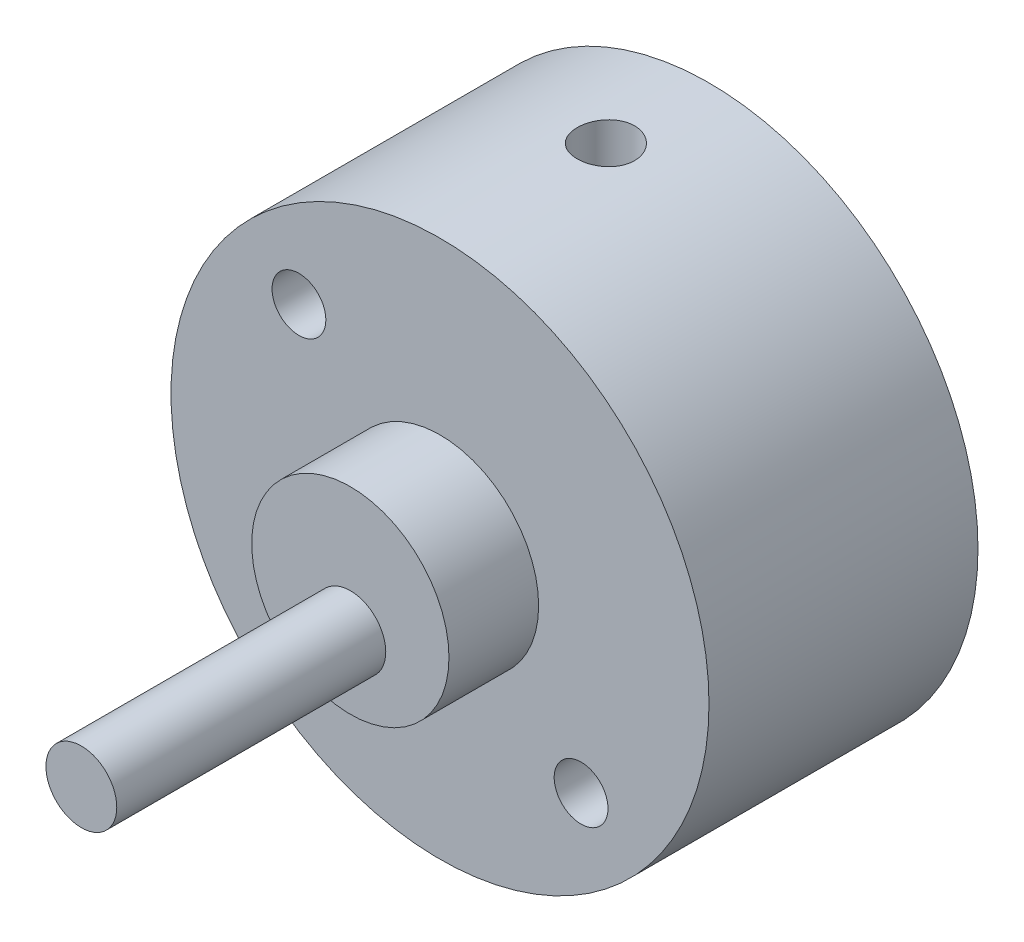
ISO-10303-21;
HEADER;
FILE_DESCRIPTION(('STEP AP214'),'2;1');
FILE_NAME('part.step','',(''),(''),'','','');
FILE_SCHEMA(('AUTOMOTIVE_DESIGN { 1 0 10303 214 1 1 1 1 }'));
ENDSEC;
DATA;
#1=APPLICATION_CONTEXT('core data for automotive mechanical design processes');
#2=APPLICATION_PROTOCOL_DEFINITION('international standard','automotive_design',2000,#1);
#3=PRODUCT_CONTEXT('',#1,'mechanical');
#4=PRODUCT('Part','Part','',(#3));
#5=PRODUCT_RELATED_PRODUCT_CATEGORY('part','',(#4));
#6=PRODUCT_DEFINITION_FORMATION('','',#4);
#7=PRODUCT_DEFINITION_CONTEXT('part definition',#1,'design');
#8=PRODUCT_DEFINITION('design','',#6,#7);
#9=PRODUCT_DEFINITION_SHAPE('','',#8);
#10=(LENGTH_UNIT() NAMED_UNIT(*) SI_UNIT(.MILLI.,.METRE.));
#11=(NAMED_UNIT(*) PLANE_ANGLE_UNIT() SI_UNIT($,.RADIAN.));
#12=(NAMED_UNIT(*) SI_UNIT($,.STERADIAN.) SOLID_ANGLE_UNIT());
#13=UNCERTAINTY_MEASURE_WITH_UNIT(LENGTH_MEASURE(1.E-05),#10,'distance_accuracy_value','');
#14=(GEOMETRIC_REPRESENTATION_CONTEXT(3) GLOBAL_UNCERTAINTY_ASSIGNED_CONTEXT((#13)) GLOBAL_UNIT_ASSIGNED_CONTEXT((#10,
#11,#12)) REPRESENTATION_CONTEXT('',''));
#15=CARTESIAN_POINT('',(0.,0.,0.));
#16=DIRECTION('',(0.,0.,1.));
#17=DIRECTION('',(1.,0.,0.));
#18=AXIS2_PLACEMENT_3D('',#15,#16,#17);
#19=CARTESIAN_POINT('',(0.,0.,40.));
#20=DIRECTION('',(0.,0.,1.));
#21=DIRECTION('',(1.,0.,0.));
#22=AXIS2_PLACEMENT_3D('',#19,#20,#21);
#23=PLANE('',#22);
#24=CARTESIAN_POINT('',(0.,0.,40.));
#25=DIRECTION('',(0.,0.,1.));
#26=DIRECTION('',(1.,0.,0.));
#27=AXIS2_PLACEMENT_3D('',#24,#25,#26);
#28=CIRCLE('',#27,11.);
#29=CARTESIAN_POINT('',(11.,0.,40.));
#30=VERTEX_POINT('',#29);
#31=EDGE_CURVE('E94',#30,#30,#28,.T.);
#32=ORIENTED_EDGE('',*,*,#31,.T.);
#33=EDGE_LOOP('',(#32));
#34=FACE_BOUND('',#33,.T.);
#35=CARTESIAN_POINT('',(0.,-3.,40.));
#36=DIRECTION('',(0.,0.,1.));
#37=DIRECTION('',(1.,0.,0.));
#38=AXIS2_PLACEMENT_3D('',#35,#36,#37);
#39=CIRCLE('',#38,3.95);
#40=CARTESIAN_POINT('',(3.95,-3.,40.));
#41=VERTEX_POINT('',#40);
#42=EDGE_CURVE('E85',#41,#41,#39,.T.);
#43=ORIENTED_EDGE('',*,*,#42,.F.);
#44=EDGE_LOOP('',(#43));
#45=FACE_BOUND('',#44,.T.);
#46=ADVANCED_FACE('F31',(#34,#45),#23,.T.);
#47=CARTESIAN_POINT('',(0.,0.,30.));
#48=DIRECTION('',(0.,0.,1.));
#49=DIRECTION('',(1.,0.,0.));
#50=AXIS2_PLACEMENT_3D('',#47,#48,#49);
#51=PLANE('',#50);
#52=CARTESIAN_POINT('',(0.,0.,30.));
#53=DIRECTION('',(0.,0.,1.));
#54=DIRECTION('',(1.,0.,0.));
#55=AXIS2_PLACEMENT_3D('',#52,#53,#54);
#56=CIRCLE('',#55,30.);
#57=CARTESIAN_POINT('',(30.,0.,30.));
#58=VERTEX_POINT('',#57);
#59=EDGE_CURVE('E10',#58,#58,#56,.T.);
#60=ORIENTED_EDGE('',*,*,#59,.T.);
#61=EDGE_LOOP('',(#60));
#62=FACE_BOUND('',#61,.T.);
#63=CARTESIAN_POINT('',(-15.7331258814007,-15.7331258814007,30.));
#64=DIRECTION('',(0.,0.,1.));
#65=DIRECTION('',(1.,0.,0.));
#66=AXIS2_PLACEMENT_3D('',#63,#64,#65);
#67=CIRCLE('',#66,3.);
#68=CARTESIAN_POINT('',(-12.7331258814007,-15.7331258814007,30.));
#69=VERTEX_POINT('',#68);
#70=EDGE_CURVE('E110',#69,#69,#67,.T.);
#71=ORIENTED_EDGE('',*,*,#70,.F.);
#72=EDGE_LOOP('',(#71));
#73=FACE_BOUND('',#72,.T.);
#74=CARTESIAN_POINT('',(15.7331258814007,-15.7331258814007,30.));
#75=DIRECTION('',(0.,0.,1.));
#76=DIRECTION('',(1.,0.,0.));
#77=AXIS2_PLACEMENT_3D('',#74,#75,#76);
#78=CIRCLE('',#77,3.);
#79=CARTESIAN_POINT('',(18.7331258814007,-15.7331258814007,30.));
#80=VERTEX_POINT('',#79);
#81=EDGE_CURVE('E105',#80,#80,#78,.T.);
#82=ORIENTED_EDGE('',*,*,#81,.F.);
#83=EDGE_LOOP('',(#82));
#84=FACE_BOUND('',#83,.T.);
#85=CARTESIAN_POINT('',(-15.7331258814007,15.7331258814007,30.));
#86=DIRECTION('',(0.,0.,1.));
#87=DIRECTION('',(1.,0.,0.));
#88=AXIS2_PLACEMENT_3D('',#85,#86,#87);
#89=CIRCLE('',#88,3.);
#90=CARTESIAN_POINT('',(-12.7331258814007,15.7331258814007,30.));
#91=VERTEX_POINT('',#90);
#92=EDGE_CURVE('E97',#91,#91,#89,.T.);
#93=ORIENTED_EDGE('',*,*,#92,.F.);
#94=EDGE_LOOP('',(#93));
#95=FACE_BOUND('',#94,.T.);
#96=CARTESIAN_POINT('',(0.,0.,30.));
#97=DIRECTION('',(0.,0.,1.));
#98=DIRECTION('',(1.,0.,0.));
#99=AXIS2_PLACEMENT_3D('',#96,#97,#98);
#100=CIRCLE('',#99,11.);
#101=CARTESIAN_POINT('',(11.,0.,30.));
#102=VERTEX_POINT('',#101);
#103=EDGE_CURVE('E91',#102,#102,#100,.T.);
#104=ORIENTED_EDGE('',*,*,#103,.F.);
#105=EDGE_LOOP('',(#104));
#106=FACE_BOUND('',#105,.T.);
#107=ADVANCED_FACE('F134',(#62,#73,#84,#95,#106),#51,.T.);
#108=CARTESIAN_POINT('',(0.,0.,30.));
#109=DIRECTION('',(0.,0.,-1.));
#110=DIRECTION('',(-1.,0.,0.));
#111=AXIS2_PLACEMENT_3D('',#108,#109,#110);
#112=CYLINDRICAL_SURFACE('',#111,30.);
#113=CARTESIAN_POINT('',(0.,-30.,14.7));
#114=CARTESIAN_POINT('',(0.179199251672659,-29.9999978155782,14.6999922731043));
#115=CARTESIAN_POINT('',(0.358515391694907,-29.9983773456172,14.6848966273665));
#116=CARTESIAN_POINT('',(0.712171813421128,-29.9920688029268,14.624907570776));
#117=CARTESIAN_POINT('',(0.886506467914534,-29.9873773938716,14.5799817510996));
#118=CARTESIAN_POINT('',(1.22502775409415,-29.9754562886114,14.4616590241123));
#119=CARTESIAN_POINT('',(1.38922061451192,-29.9682281689653,14.3882797975528));
#120=CARTESIAN_POINT('',(1.70292513546,-29.9520408111386,14.2151686638501));
#121=CARTESIAN_POINT('',(1.85243960893433,-29.9430819056237,14.1154418194991));
#122=CARTESIAN_POINT('',(2.13318600799855,-29.9243949824671,13.8920314802744));
#123=CARTESIAN_POINT('',(2.26434977367924,-29.9146642973937,13.7682625478437));
#124=CARTESIAN_POINT('',(2.50408534612756,-29.8955524431016,13.5004640196879));
#125=CARTESIAN_POINT('',(2.61265608298657,-29.8861712904526,13.3564334650006));
#126=CARTESIAN_POINT('',(2.80436852977279,-29.8687937297875,13.0517690708686));
#127=CARTESIAN_POINT('',(2.88744796611103,-29.8608007332764,12.8910958339937));
#128=CARTESIAN_POINT('',(3.0254218574978,-29.8471381901901,12.5579795934242));
#129=CARTESIAN_POINT('',(3.080317099305,-29.8414685787587,12.3855369184245));
#130=CARTESIAN_POINT('',(3.16016085524205,-29.8331192689389,12.0344755373635));
#131=CARTESIAN_POINT('',(3.18522300912972,-29.8304282273939,11.8558829513394));
#132=CARTESIAN_POINT('',(3.20504053830253,-29.8283056835682,11.4970076754329));
#133=CARTESIAN_POINT('',(3.19979681323847,-29.8288740845287,11.3167250358795));
#134=CARTESIAN_POINT('',(3.1592450020435,-29.8331958367535,10.9603726692181));
#135=CARTESIAN_POINT('',(3.12406126184819,-29.8369360148708,10.7842886096425));
#136=CARTESIAN_POINT('',(3.02482176755911,-29.8471593333771,10.440538866147));
#137=CARTESIAN_POINT('',(2.96076557522673,-29.8536425154005,10.27287331005));
#138=CARTESIAN_POINT('',(2.80546312918687,-29.8686364634621,9.95032877446278));
#139=CARTESIAN_POINT('',(2.71416198595705,-29.8771513156333,9.79547642148652));
#140=CARTESIAN_POINT('',(2.50700073855399,-29.8952458240919,9.50324544733669));
#141=CARTESIAN_POINT('',(2.39113981611696,-29.9048255158517,9.36586740860291));
#142=CARTESIAN_POINT('',(2.13745469061558,-29.9240289927655,9.11176235133448));
#143=CARTESIAN_POINT('',(1.99952314980828,-29.9336527578517,8.99514246482594));
#144=CARTESIAN_POINT('',(1.70598410158881,-29.9518147282086,8.7866954056647));
#145=CARTESIAN_POINT('',(1.55037656997585,-29.960352931993,8.69486826695717));
#146=CARTESIAN_POINT('',(1.22582638255156,-29.9753851309898,8.53861656639516));
#147=CARTESIAN_POINT('',(1.05688093868519,-29.9818786973843,8.47419775184311));
#148=CARTESIAN_POINT('',(0.710487044561349,-29.992085740675,8.37467142431901));
#149=CARTESIAN_POINT('',(0.533038883954597,-29.9957993122021,8.3395629136215));
#150=CARTESIAN_POINT('',(0.175604065124882,-30.0000157584666,8.29979042605484));
#151=CARTESIAN_POINT('',(-0.00436597402798201,-30.0005342169671,8.29497867802547));
#152=CARTESIAN_POINT('',(-0.362549880203694,-29.9983438788441,8.31554773208168));
#153=CARTESIAN_POINT('',(-0.540763774240855,-29.9956351319423,8.34092806899712));
#154=CARTESIAN_POINT('',(-0.88994770866028,-29.9873046487267,8.42103820042687));
#155=CARTESIAN_POINT('',(-1.06093387274944,-29.9816898116567,8.47569849315419));
#156=CARTESIAN_POINT('',(-1.39131065897392,-29.9681767166743,8.61274530253382));
#157=CARTESIAN_POINT('',(-1.55070098737543,-29.9602784009444,8.69513252123899));
#158=CARTESIAN_POINT('',(-1.85402772608127,-29.9430422329916,8.8856587864797));
#159=CARTESIAN_POINT('',(-1.99790307434316,-29.9336990216387,8.99389455389666));
#160=CARTESIAN_POINT('',(-2.26549688705065,-29.9146378039475,9.23290727618769));
#161=CARTESIAN_POINT('',(-2.38921477419307,-29.9049197868849,9.3636848764319));
#162=CARTESIAN_POINT('',(-2.61349761286354,-29.8861570498013,9.64471528118529));
#163=CARTESIAN_POINT('',(-2.71396533903854,-29.8771152604701,9.7950459021147));
#164=CARTESIAN_POINT('',(-2.88822677155093,-29.8607742535699,10.1105327374213));
#165=CARTESIAN_POINT('',(-2.96202088566411,-29.8534750093622,10.2756887251059));
#166=CARTESIAN_POINT('',(-3.08067889005422,-29.8414643015591,10.6158095433255));
#167=CARTESIAN_POINT('',(-3.12559988278291,-29.8367477329533,10.7907542647154));
#168=CARTESIAN_POINT('',(-3.1854214608927,-29.830420874758,11.1457563842201));
#169=CARTESIAN_POINT('',(-3.20032303700234,-29.8288104826556,11.3258136134083));
#170=CARTESIAN_POINT('',(-3.19966795265396,-29.8288806841576,11.684963054554));
#171=CARTESIAN_POINT('',(-3.1842640178033,-29.8305447759015,11.864055567793));
#172=CARTESIAN_POINT('',(-3.12375617883762,-29.8369411879745,12.2170925251036));
#173=CARTESIAN_POINT('',(-3.07865224773433,-29.8416735110916,12.3910369644971));
#174=CARTESIAN_POINT('',(-2.96006831835794,-29.8536684674422,12.7288342403487));
#175=CARTESIAN_POINT('',(-2.88659352672016,-29.8609306363731,12.8926889220907));
#176=CARTESIAN_POINT('',(-2.71336901873095,-29.8771679234131,13.2057654489702));
#177=CARTESIAN_POINT('',(-2.61361933138548,-29.8861430396312,13.3549873102613));
#178=CARTESIAN_POINT('',(-2.39010431021841,-29.9048491721616,13.6353448158184));
#179=CARTESIAN_POINT('',(-2.26622508008868,-29.9145836367037,13.766389429491));
#180=CARTESIAN_POINT('',(-1.99819728323306,-29.9336803472193,14.0058953385163));
#181=CARTESIAN_POINT('',(-1.85404388871613,-29.9430425038536,14.1143512396203));
#182=CARTESIAN_POINT('',(-1.54910759178365,-29.9603677503939,14.3058480487093));
#183=CARTESIAN_POINT('',(-1.38827887984262,-29.9683268149098,14.3888163240747));
#184=CARTESIAN_POINT('',(-1.05498690754691,-29.9819063168791,14.5264564853847));
#185=CARTESIAN_POINT('',(-0.882536894221084,-29.9875293664341,14.5811599934044));
#186=CARTESIAN_POINT('',(-0.590941949328468,-29.9944043420799,14.6472102289755));
#187=CARTESIAN_POINT('',(-0.473655329833461,-29.9964928225554,14.6669790061446));
#188=CARTESIAN_POINT('',(-0.237596266494697,-29.9992913723967,14.6933764215593));
#189=CARTESIAN_POINT('',(-0.11882382986366,-30.0000014484512,14.7000051235668));
#190=CARTESIAN_POINT('',(0.,-30.,14.7));
#191=B_SPLINE_CURVE_WITH_KNOTS('',3,(#113,#114,#115,#116,#117,#118,#119,#120,#121,#122,#123,
#124,#125,#126,#127,#128,#129,#130,#131,#132,#133,#134,#135,#136,#137,#138,#139,#140,#141,#142,
#143,#144,#145,#146,#147,#148,#149,#150,#151,#152,#153,#154,#155,#156,#157,#158,#159,#160,#161,
#162,#163,#164,#165,#166,#167,#168,#169,#170,#171,#172,#173,#174,#175,#176,#177,#178,#179,#180,
#181,#182,#183,#184,#185,#186,#187,#188,#189,#190),.UNSPECIFIED.,.T.,.F.,(4,2,2,2,2,2,2,2,2,2,2,
2,2,2,2,2,2,2,2,2,2,2,2,2,2,2,2,2,2,2,2,2,2,2,2,2,2,2,4),(0.,0.537163824869167,1.07491220533631,
1.61232696676546,2.14963853697056,2.68889566862181,3.22817833136186,3.76876812573331,
4.30934282877971,4.84785172522199,5.38634463574051,5.92261194862769,6.45888740148708,
6.99625065051098,7.53363180580388,8.07371066140847,8.61379025646228,9.15398304606171,
9.69415744669857,10.2316951157315,10.7692245030166,11.3054835751921,11.841756226606,
12.3800678582721,12.9183949043004,13.458933960717,13.9994647532339,14.5389232202349,
15.0783638832371,15.6150929804679,16.151822565423,16.6884536962606,17.2250842346912,
17.7643120014977,18.3036683901565,18.8445478331012,19.3848208331264,19.7410063197586,
20.097190078002),.UNSPECIFIED.);
#192=CARTESIAN_POINT('',(0.,-30.,14.7));
#193=VERTEX_POINT('',#192);
#194=EDGE_CURVE('E72',#193,#193,#191,.T.);
#195=ORIENTED_EDGE('',*,*,#194,.T.);
#196=EDGE_LOOP('',(#195));
#197=FACE_BOUND('',#196,.T.);
#198=CARTESIAN_POINT('',(0.,30.,14.7));
#199=CARTESIAN_POINT('',(-0.179199251672659,29.9999978155782,14.6999922731043));
#200=CARTESIAN_POINT('',(-0.358515391694907,29.9983773456172,14.6848966273665));
#201=CARTESIAN_POINT('',(-0.712171813421128,29.9920688029268,14.624907570776));
#202=CARTESIAN_POINT('',(-0.886506467914534,29.9873773938716,14.5799817510996));
#203=CARTESIAN_POINT('',(-1.22502775409415,29.9754562886114,14.4616590241123));
#204=CARTESIAN_POINT('',(-1.38922061451192,29.9682281689653,14.3882797975528));
#205=CARTESIAN_POINT('',(-1.70292513546,29.9520408111386,14.2151686638501));
#206=CARTESIAN_POINT('',(-1.85243960893433,29.9430819056237,14.1154418194991));
#207=CARTESIAN_POINT('',(-2.13318600799855,29.9243949824671,13.8920314802744));
#208=CARTESIAN_POINT('',(-2.26434977367924,29.9146642973937,13.7682625478437));
#209=CARTESIAN_POINT('',(-2.50408534612756,29.8955524431016,13.5004640196879));
#210=CARTESIAN_POINT('',(-2.61265608298657,29.8861712904526,13.3564334650006));
#211=CARTESIAN_POINT('',(-2.80436852977279,29.8687937297875,13.0517690708686));
#212=CARTESIAN_POINT('',(-2.88744796611103,29.8608007332764,12.8910958339937));
#213=CARTESIAN_POINT('',(-3.0254218574978,29.8471381901901,12.5579795934242));
#214=CARTESIAN_POINT('',(-3.080317099305,29.8414685787587,12.3855369184245));
#215=CARTESIAN_POINT('',(-3.16016085524205,29.8331192689389,12.0344755373635));
#216=CARTESIAN_POINT('',(-3.18522300912972,29.8304282273939,11.8558829513394));
#217=CARTESIAN_POINT('',(-3.20504053830253,29.8283056835682,11.4970076754329));
#218=CARTESIAN_POINT('',(-3.19979681323847,29.8288740845287,11.3167250358795));
#219=CARTESIAN_POINT('',(-3.1592450020435,29.8331958367535,10.9603726692181));
#220=CARTESIAN_POINT('',(-3.12406126184819,29.8369360148708,10.7842886096425));
#221=CARTESIAN_POINT('',(-3.02482176755911,29.8471593333771,10.440538866147));
#222=CARTESIAN_POINT('',(-2.96076557522673,29.8536425154005,10.27287331005));
#223=CARTESIAN_POINT('',(-2.80546312918687,29.8686364634621,9.95032877446278));
#224=CARTESIAN_POINT('',(-2.71416198595705,29.8771513156333,9.79547642148652));
#225=CARTESIAN_POINT('',(-2.50700073855399,29.8952458240919,9.50324544733669));
#226=CARTESIAN_POINT('',(-2.39113981611696,29.9048255158517,9.36586740860291));
#227=CARTESIAN_POINT('',(-2.13745469061558,29.9240289927655,9.11176235133448));
#228=CARTESIAN_POINT('',(-1.99952314980828,29.9336527578517,8.99514246482594));
#229=CARTESIAN_POINT('',(-1.70598410158881,29.9518147282086,8.7866954056647));
#230=CARTESIAN_POINT('',(-1.55037656997585,29.960352931993,8.69486826695717));
#231=CARTESIAN_POINT('',(-1.22582638255156,29.9753851309898,8.53861656639516));
#232=CARTESIAN_POINT('',(-1.05688093868519,29.9818786973843,8.47419775184311));
#233=CARTESIAN_POINT('',(-0.710487044561349,29.992085740675,8.37467142431901));
#234=CARTESIAN_POINT('',(-0.533038883954597,29.9957993122021,8.3395629136215));
#235=CARTESIAN_POINT('',(-0.175604065124882,30.0000157584666,8.29979042605484));
#236=CARTESIAN_POINT('',(0.00436597402798201,30.0005342169671,8.29497867802547));
#237=CARTESIAN_POINT('',(0.362549880203694,29.9983438788441,8.31554773208168));
#238=CARTESIAN_POINT('',(0.540763774240855,29.9956351319423,8.34092806899712));
#239=CARTESIAN_POINT('',(0.88994770866028,29.9873046487267,8.42103820042687));
#240=CARTESIAN_POINT('',(1.06093387274944,29.9816898116567,8.47569849315419));
#241=CARTESIAN_POINT('',(1.39131065897392,29.9681767166743,8.61274530253382));
#242=CARTESIAN_POINT('',(1.55070098737543,29.9602784009444,8.69513252123899));
#243=CARTESIAN_POINT('',(1.85402772608127,29.9430422329916,8.8856587864797));
#244=CARTESIAN_POINT('',(1.99790307434316,29.9336990216387,8.99389455389666));
#245=CARTESIAN_POINT('',(2.26549688705065,29.9146378039475,9.23290727618769));
#246=CARTESIAN_POINT('',(2.38921477419307,29.9049197868849,9.3636848764319));
#247=CARTESIAN_POINT('',(2.61349761286354,29.8861570498013,9.64471528118529));
#248=CARTESIAN_POINT('',(2.71396533903854,29.8771152604701,9.7950459021147));
#249=CARTESIAN_POINT('',(2.88822677155093,29.8607742535699,10.1105327374213));
#250=CARTESIAN_POINT('',(2.96202088566411,29.8534750093622,10.2756887251059));
#251=CARTESIAN_POINT('',(3.08067889005422,29.8414643015591,10.6158095433255));
#252=CARTESIAN_POINT('',(3.12559988278291,29.8367477329533,10.7907542647154));
#253=CARTESIAN_POINT('',(3.1854214608927,29.830420874758,11.1457563842201));
#254=CARTESIAN_POINT('',(3.20032303700234,29.8288104826556,11.3258136134083));
#255=CARTESIAN_POINT('',(3.19966795265396,29.8288806841576,11.684963054554));
#256=CARTESIAN_POINT('',(3.1842640178033,29.8305447759015,11.864055567793));
#257=CARTESIAN_POINT('',(3.12375617883762,29.8369411879745,12.2170925251036));
#258=CARTESIAN_POINT('',(3.07865224773433,29.8416735110916,12.3910369644971));
#259=CARTESIAN_POINT('',(2.96006831835794,29.8536684674422,12.7288342403487));
#260=CARTESIAN_POINT('',(2.88659352672016,29.8609306363731,12.8926889220907));
#261=CARTESIAN_POINT('',(2.71336901873095,29.8771679234131,13.2057654489702));
#262=CARTESIAN_POINT('',(2.61361933138548,29.8861430396312,13.3549873102613));
#263=CARTESIAN_POINT('',(2.39010431021841,29.9048491721616,13.6353448158184));
#264=CARTESIAN_POINT('',(2.26622508008868,29.9145836367037,13.766389429491));
#265=CARTESIAN_POINT('',(1.99819728323306,29.9336803472193,14.0058953385163));
#266=CARTESIAN_POINT('',(1.85404388871613,29.9430425038536,14.1143512396203));
#267=CARTESIAN_POINT('',(1.54910759178365,29.9603677503939,14.3058480487093));
#268=CARTESIAN_POINT('',(1.38827887984262,29.9683268149098,14.3888163240747));
#269=CARTESIAN_POINT('',(1.05498690754691,29.9819063168791,14.5264564853847));
#270=CARTESIAN_POINT('',(0.882536894221084,29.9875293664341,14.5811599934044));
#271=CARTESIAN_POINT('',(0.590941949328468,29.9944043420799,14.6472102289755));
#272=CARTESIAN_POINT('',(0.473655329833461,29.9964928225554,14.6669790061446));
#273=CARTESIAN_POINT('',(0.237596266494697,29.9992913723967,14.6933764215593));
#274=CARTESIAN_POINT('',(0.11882382986366,30.0000014484512,14.7000051235668));
#275=CARTESIAN_POINT('',(0.,30.,14.7));
#276=B_SPLINE_CURVE_WITH_KNOTS('',3,(#198,#199,#200,#201,#202,#203,#204,#205,#206,#207,#208,
#209,#210,#211,#212,#213,#214,#215,#216,#217,#218,#219,#220,#221,#222,#223,#224,#225,#226,#227,
#228,#229,#230,#231,#232,#233,#234,#235,#236,#237,#238,#239,#240,#241,#242,#243,#244,#245,#246,
#247,#248,#249,#250,#251,#252,#253,#254,#255,#256,#257,#258,#259,#260,#261,#262,#263,#264,#265,
#266,#267,#268,#269,#270,#271,#272,#273,#274,#275),.UNSPECIFIED.,.T.,.F.,(4,2,2,2,2,2,2,2,2,2,2,
2,2,2,2,2,2,2,2,2,2,2,2,2,2,2,2,2,2,2,2,2,2,2,2,2,2,2,4),(0.,0.537163824869167,1.07491220533631,
1.61232696676546,2.14963853697056,2.68889566862181,3.22817833136186,3.76876812573331,
4.30934282877971,4.84785172522199,5.38634463574051,5.92261194862769,6.45888740148708,
6.99625065051098,7.53363180580388,8.07371066140847,8.61379025646228,9.15398304606171,
9.69415744669857,10.2316951157315,10.7692245030166,11.3054835751921,11.841756226606,
12.3800678582721,12.9183949043004,13.458933960717,13.9994647532339,14.5389232202349,
15.0783638832371,15.6150929804679,16.151822565423,16.6884536962606,17.2250842346912,
17.7643120014977,18.3036683901565,18.8445478331012,19.3848208331264,19.7410063197586,
20.097190078002),.UNSPECIFIED.);
#277=CARTESIAN_POINT('',(0.,30.,14.7));
#278=VERTEX_POINT('',#277);
#279=EDGE_CURVE('E76',#278,#278,#276,.T.);
#280=ORIENTED_EDGE('',*,*,#279,.T.);
#281=EDGE_LOOP('',(#280));
#282=FACE_BOUND('',#281,.T.);
#283=ORIENTED_EDGE('',*,*,#59,.F.);
#284=EDGE_LOOP('',(#283));
#285=FACE_BOUND('',#284,.T.);
#286=CARTESIAN_POINT('',(0.,0.,0.));
#287=DIRECTION('',(0.,0.,1.));
#288=DIRECTION('',(1.,0.,0.));
#289=AXIS2_PLACEMENT_3D('',#286,#287,#288);
#290=CIRCLE('',#289,30.);
#291=CARTESIAN_POINT('',(30.,0.,0.));
#292=VERTEX_POINT('',#291);
#293=EDGE_CURVE('E44',#292,#292,#290,.T.);
#294=ORIENTED_EDGE('',*,*,#293,.T.);
#295=EDGE_LOOP('',(#294));
#296=FACE_BOUND('',#295,.T.);
#297=ADVANCED_FACE('F33',(#197,#282,#285,#296),#112,.T.);
#298=CARTESIAN_POINT('',(0.,0.,0.));
#299=DIRECTION('',(0.,0.,1.));
#300=DIRECTION('',(1.,0.,0.));
#301=AXIS2_PLACEMENT_3D('',#298,#299,#300);
#302=PLANE('',#301);
#303=CARTESIAN_POINT('',(0.,0.,0.));
#304=DIRECTION('',(0.,0.,-1.));
#305=DIRECTION('',(-1.,0.,0.));
#306=AXIS2_PLACEMENT_3D('',#303,#304,#305);
#307=CIRCLE('',#306,10.25);
#308=CARTESIAN_POINT('',(-10.25,0.,0.));
#309=VERTEX_POINT('',#308);
#310=EDGE_CURVE('E81',#309,#309,#307,.T.);
#311=ORIENTED_EDGE('',*,*,#310,.F.);
#312=EDGE_LOOP('',(#311));
#313=FACE_BOUND('',#312,.T.);
#314=CARTESIAN_POINT('',(-15.7331258814007,15.7331258814007,0.));
#315=DIRECTION('',(0.,0.,1.));
#316=DIRECTION('',(1.,0.,0.));
#317=AXIS2_PLACEMENT_3D('',#314,#315,#316);
#318=CIRCLE('',#317,3.);
#319=CARTESIAN_POINT('',(-12.7331258814007,15.7331258814007,0.));
#320=VERTEX_POINT('',#319);
#321=EDGE_CURVE('E102',#320,#320,#318,.T.);
#322=ORIENTED_EDGE('',*,*,#321,.T.);
#323=EDGE_LOOP('',(#322));
#324=FACE_BOUND('',#323,.T.);
#325=CARTESIAN_POINT('',(15.7331258814007,-15.7331258814007,0.));
#326=DIRECTION('',(0.,0.,1.));
#327=DIRECTION('',(1.,0.,0.));
#328=AXIS2_PLACEMENT_3D('',#325,#326,#327);
#329=CIRCLE('',#328,3.);
#330=CARTESIAN_POINT('',(18.7331258814007,-15.7331258814007,0.));
#331=VERTEX_POINT('',#330);
#332=EDGE_CURVE('E108',#331,#331,#329,.T.);
#333=ORIENTED_EDGE('',*,*,#332,.T.);
#334=EDGE_LOOP('',(#333));
#335=FACE_BOUND('',#334,.T.);
#336=CARTESIAN_POINT('',(-15.7331258814007,-15.7331258814007,0.));
#337=DIRECTION('',(0.,0.,1.));
#338=DIRECTION('',(1.,0.,0.));
#339=AXIS2_PLACEMENT_3D('',#336,#337,#338);
#340=CIRCLE('',#339,3.);
#341=CARTESIAN_POINT('',(-12.7331258814007,-15.7331258814007,0.));
#342=VERTEX_POINT('',#341);
#343=EDGE_CURVE('E49',#342,#342,#340,.T.);
#344=ORIENTED_EDGE('',*,*,#343,.T.);
#345=EDGE_LOOP('',(#344));
#346=FACE_BOUND('',#345,.T.);
#347=ORIENTED_EDGE('',*,*,#293,.F.);
#348=EDGE_LOOP('',(#347));
#349=FACE_BOUND('',#348,.T.);
#350=ADVANCED_FACE('F117',(#313,#324,#335,#346,#349),#302,.F.);
#351=CARTESIAN_POINT('',(-15.7331258814007,-15.7331258814007,30.));
#352=DIRECTION('',(0.,0.,1.));
#353=DIRECTION('',(1.,0.,0.));
#354=AXIS2_PLACEMENT_3D('',#351,#352,#353);
#355=CYLINDRICAL_SURFACE('',#354,3.);
#356=ORIENTED_EDGE('',*,*,#343,.F.);
#357=EDGE_LOOP('',(#356));
#358=FACE_BOUND('',#357,.T.);
#359=ORIENTED_EDGE('',*,*,#70,.T.);
#360=EDGE_LOOP('',(#359));
#361=FACE_BOUND('',#360,.T.);
#362=ADVANCED_FACE('F120',(#358,#361),#355,.F.);
#363=CARTESIAN_POINT('',(15.7331258814007,-15.7331258814007,30.));
#364=DIRECTION('',(0.,0.,1.));
#365=DIRECTION('',(1.,0.,0.));
#366=AXIS2_PLACEMENT_3D('',#363,#364,#365);
#367=CYLINDRICAL_SURFACE('',#366,3.);
#368=ORIENTED_EDGE('',*,*,#332,.F.);
#369=EDGE_LOOP('',(#368));
#370=FACE_BOUND('',#369,.T.);
#371=ORIENTED_EDGE('',*,*,#81,.T.);
#372=EDGE_LOOP('',(#371));
#373=FACE_BOUND('',#372,.T.);
#374=ADVANCED_FACE('F122',(#370,#373),#367,.F.);
#375=CARTESIAN_POINT('',(-15.7331258814007,15.7331258814007,30.));
#376=DIRECTION('',(0.,0.,1.));
#377=DIRECTION('',(1.,0.,0.));
#378=AXIS2_PLACEMENT_3D('',#375,#376,#377);
#379=CYLINDRICAL_SURFACE('',#378,3.);
#380=ORIENTED_EDGE('',*,*,#321,.F.);
#381=EDGE_LOOP('',(#380));
#382=FACE_BOUND('',#381,.T.);
#383=ORIENTED_EDGE('',*,*,#92,.T.);
#384=EDGE_LOOP('',(#383));
#385=FACE_BOUND('',#384,.T.);
#386=ADVANCED_FACE('F128',(#382,#385),#379,.F.);
#387=CARTESIAN_POINT('',(0.,0.,40.));
#388=DIRECTION('',(0.,0.,-1.));
#389=DIRECTION('',(-1.,0.,0.));
#390=AXIS2_PLACEMENT_3D('',#387,#388,#389);
#391=CYLINDRICAL_SURFACE('',#390,11.);
#392=ORIENTED_EDGE('',*,*,#31,.F.);
#393=EDGE_LOOP('',(#392));
#394=FACE_BOUND('',#393,.T.);
#395=ORIENTED_EDGE('',*,*,#103,.T.);
#396=EDGE_LOOP('',(#395));
#397=FACE_BOUND('',#396,.T.);
#398=ADVANCED_FACE('F144',(#394,#397),#391,.T.);
#399=CARTESIAN_POINT('',(0.,-3.,70.));
#400=DIRECTION('',(0.,0.,-1.));
#401=DIRECTION('',(-1.,0.,0.));
#402=AXIS2_PLACEMENT_3D('',#399,#400,#401);
#403=CYLINDRICAL_SURFACE('',#402,3.95);
#404=CARTESIAN_POINT('',(0.,-3.,70.));
#405=DIRECTION('',(0.,0.,1.));
#406=DIRECTION('',(1.,0.,0.));
#407=AXIS2_PLACEMENT_3D('',#404,#405,#406);
#408=CIRCLE('',#407,3.95);
#409=CARTESIAN_POINT('',(3.95,-3.,70.));
#410=VERTEX_POINT('',#409);
#411=EDGE_CURVE('E88',#410,#410,#408,.T.);
#412=ORIENTED_EDGE('',*,*,#411,.F.);
#413=EDGE_LOOP('',(#412));
#414=FACE_BOUND('',#413,.T.);
#415=ORIENTED_EDGE('',*,*,#42,.T.);
#416=EDGE_LOOP('',(#415));
#417=FACE_BOUND('',#416,.T.);
#418=ADVANCED_FACE('F143',(#414,#417),#403,.T.);
#419=CARTESIAN_POINT('',(0.,-3.,70.));
#420=DIRECTION('',(0.,0.,1.));
#421=DIRECTION('',(1.,0.,0.));
#422=AXIS2_PLACEMENT_3D('',#419,#420,#421);
#423=PLANE('',#422);
#424=ORIENTED_EDGE('',*,*,#411,.T.);
#425=EDGE_LOOP('',(#424));
#426=FACE_BOUND('',#425,.T.);
#427=ADVANCED_FACE('F178',(#426),#423,.T.);
#428=CARTESIAN_POINT('',(0.,0.,20.5));
#429=DIRECTION('',(0.,0.,-1.));
#430=DIRECTION('',(-1.,0.,0.));
#431=AXIS2_PLACEMENT_3D('',#428,#429,#430);
#432=CYLINDRICAL_SURFACE('',#431,10.25);
#433=CARTESIAN_POINT('',(0.,-10.25,14.7));
#434=CARTESIAN_POINT('',(-0.175212867856478,-10.2499991094465,14.6999988311415));
#435=CARTESIAN_POINT('',(-0.350437960036871,-10.2454649635397,14.6855621616731));
#436=CARTESIAN_POINT('',(-0.695764380878263,-10.2278215503184,14.6283479318168));
#437=CARTESIAN_POINT('',(-0.865864531438014,-10.2147103268365,14.5855639062405));
#438=CARTESIAN_POINT('',(-1.19591143964831,-10.1813451700784,14.4732379466814));
#439=CARTESIAN_POINT('',(-1.35587345199291,-10.1611022839909,14.403737382441));
#440=CARTESIAN_POINT('',(-1.66187307846957,-10.1155642539425,14.2401270633784));
#441=CARTESIAN_POINT('',(-1.80790850181712,-10.0902683170195,14.1460134453753));
#442=CARTESIAN_POINT('',(-2.08641261994549,-10.0364373059115,13.9327940980653));
#443=CARTESIAN_POINT('',(-2.21839167830629,-10.0078317656026,13.8130666697312));
#444=CARTESIAN_POINT('',(-2.46076150747352,-9.95101402960555,13.5533420911416));
#445=CARTESIAN_POINT('',(-2.57114826902388,-9.92280190786879,13.413341184891));
#446=CARTESIAN_POINT('',(-2.76985308790866,-9.86920941840707,13.1128073007915));
#447=CARTESIAN_POINT('',(-2.85755981282086,-9.843916036473,12.9518531436141));
#448=CARTESIAN_POINT('',(-3.00445710447589,-9.8000845156351,12.6165622575796));
#449=CARTESIAN_POINT('',(-3.06365516635568,-9.78154460150756,12.4422290601596));
#450=CARTESIAN_POINT('',(-3.15006372503107,-9.75405618765335,12.0906532687166));
#451=CARTESIAN_POINT('',(-3.17818235590229,-9.74483609905237,11.9136556966844));
#452=CARTESIAN_POINT('',(-3.20447095902842,-9.73622487441716,11.5572335375477));
#453=CARTESIAN_POINT('',(-3.20264887536903,-9.73683113118574,11.3778096068458));
#454=CARTESIAN_POINT('',(-3.16981813196436,-9.7475643452651,11.029136917846));
#455=CARTESIAN_POINT('',(-3.13996350132722,-9.75731483822357,10.859765957458));
#456=CARTESIAN_POINT('',(-3.05378606162874,-9.78462637592921,10.5285683348647));
#457=CARTESIAN_POINT('',(-2.99746044458791,-9.80218824927851,10.366742475028));
#458=CARTESIAN_POINT('',(-2.85912405411437,-9.8434325922443,10.0524777168075));
#459=CARTESIAN_POINT('',(-2.77675061401972,-9.86720060204017,9.90021016903221));
#460=CARTESIAN_POINT('',(-2.58890873640075,-9.91813992391075,9.6112801572576));
#461=CARTESIAN_POINT('',(-2.4834343094021,-9.94531211781687,9.47462175430329));
#462=CARTESIAN_POINT('',(-2.24671993846225,-10.0015088609132,9.21426456648148));
#463=CARTESIAN_POINT('',(-2.1145271858889,-10.0305614835319,9.09143653452828));
#464=CARTESIAN_POINT('',(-1.83105852396157,-10.0861567727754,8.86948086976539));
#465=CARTESIAN_POINT('',(-1.67978120759139,-10.1126992540866,8.77035498596666));
#466=CARTESIAN_POINT('',(-1.36076187832982,-10.1605614294148,8.59802894891384));
#467=CARTESIAN_POINT('',(-1.19290111810984,-10.1818389600154,8.52503612519676));
#468=CARTESIAN_POINT('',(-0.846464728037001,-10.2164694743786,8.40858217232109));
#469=CARTESIAN_POINT('',(-0.667892362972051,-10.2298248593524,8.36511209420561));
#470=CARTESIAN_POINT('',(-0.312493229654602,-10.2467200733544,8.3104200547635));
#471=CARTESIAN_POINT('',(-0.135864652819121,-10.2506185230224,8.29801927157405));
#472=CARTESIAN_POINT('',(0.216968428431098,-10.249221041755,8.30249464121427));
#473=CARTESIAN_POINT('',(0.393172990911571,-10.2439264510476,8.3193665264624));
#474=CARTESIAN_POINT('',(0.735611760997362,-10.2249734168072,8.38096178983875));
#475=CARTESIAN_POINT('',(0.901984861816165,-10.2115256620901,8.42498404452542));
#476=CARTESIAN_POINT('',(1.22493721630835,-10.1778392736596,8.53877519848661));
#477=CARTESIAN_POINT('',(1.38151525833597,-10.1575998017758,8.60854727567003));
#478=CARTESIAN_POINT('',(1.68467334643056,-10.1117983649595,8.77375703326192));
#479=CARTESIAN_POINT('',(1.83091710318303,-10.0861187978903,8.86977830100322));
#480=CARTESIAN_POINT('',(2.10561126980025,-10.0323737994354,9.08406034829555));
#481=CARTESIAN_POINT('',(2.23405684640433,-10.004307723297,9.20232714835213));
#482=CARTESIAN_POINT('',(2.47478051574378,-9.94755623532086,9.46328738185816));
#483=CARTESIAN_POINT('',(2.58621847199264,-9.91889021747858,9.60676177955895));
#484=CARTESIAN_POINT('',(2.78351130108841,-9.86534598631895,9.9109972517127));
#485=CARTESIAN_POINT('',(2.8693665876061,-9.84046771175712,10.0717580465881));
#486=CARTESIAN_POINT('',(3.01252187077278,-9.7975919675904,10.4056661320977));
#487=CARTESIAN_POINT('',(3.06993305555711,-9.77956777067891,10.5787621179484));
#488=CARTESIAN_POINT('',(3.15458925531694,-9.75259345053908,10.9328420939615));
#489=CARTESIAN_POINT('',(3.18184572034587,-9.74363988320948,11.1138230629656));
#490=CARTESIAN_POINT('',(3.20459764978245,-9.73617896397137,11.4697542841513));
#491=CARTESIAN_POINT('',(3.20147113419911,-9.73721835769416,11.6446080393965));
#492=CARTESIAN_POINT('',(3.16687151115884,-9.74852545546354,11.9911686128812));
#493=CARTESIAN_POINT('',(3.13539972121021,-9.75879273059166,12.1628755770073));
#494=CARTESIAN_POINT('',(3.04592454718823,-9.78708232595138,12.4958095206709));
#495=CARTESIAN_POINT('',(2.98831475968088,-9.80498937281362,12.6571528126402));
#496=CARTESIAN_POINT('',(2.84850878883845,-9.84651160991639,12.9680121096741));
#497=CARTESIAN_POINT('',(2.76630761128159,-9.87012795946194,13.1175257044598));
#498=CARTESIAN_POINT('',(2.57589739735941,-9.92155862290413,13.4068025441763));
#499=CARTESIAN_POINT('',(2.46679798682669,-9.94950086862282,13.5459569173216));
#500=CARTESIAN_POINT('',(2.22725586991574,-10.0058457426918,13.8044290880622));
#501=CARTESIAN_POINT('',(2.09680745903759,-10.0342484922573,13.9237415666332));
#502=CARTESIAN_POINT('',(1.81315870647897,-10.089423734557,14.1430322523867));
#503=CARTESIAN_POINT('',(1.65935576534931,-10.11611301241,14.2422542713491));
#504=CARTESIAN_POINT('',(1.33642010413926,-10.1638112232005,14.413302903853));
#505=CARTESIAN_POINT('',(1.16729347207484,-10.184822398917,14.485140338579));
#506=CARTESIAN_POINT('',(0.833375607225345,-10.2173231510056,14.5941330624018));
#507=CARTESIAN_POINT('',(0.669439600441984,-10.2294706946511,14.6337189591153));
#508=CARTESIAN_POINT('',(0.337005547457017,-10.2458087460316,14.686650347293));
#509=CARTESIAN_POINT('',(0.168508427081544,-10.2500008564768,14.7000011241327));
#510=CARTESIAN_POINT('',(0.,-10.25,14.7));
#511=B_SPLINE_CURVE_WITH_KNOTS('',3,(#433,#434,#435,#436,#437,#438,#439,#440,#441,#442,#443,
#444,#445,#446,#447,#448,#449,#450,#451,#452,#453,#454,#455,#456,#457,#458,#459,#460,#461,#462,
#463,#464,#465,#466,#467,#468,#469,#470,#471,#472,#473,#474,#475,#476,#477,#478,#479,#480,#481,
#482,#483,#484,#485,#486,#487,#488,#489,#490,#491,#492,#493,#494,#495,#496,#497,#498,#499,#500,
#501,#502,#503,#504,#505,#506,#507,#508,#509,#510),.UNSPECIFIED.,.T.,.F.,(4,2,2,2,2,2,2,2,2,2,2,
2,2,2,2,2,2,2,2,2,2,2,2,2,2,2,2,2,2,2,2,2,2,2,2,2,2,2,4),(0.,0.525019231655943,1.05015824581489,
1.57448735271135,2.09889880595751,2.63787969173613,3.17696056064364,3.72933497302422,
4.28156408272506,4.8171916420323,5.35267708707889,5.86704159368083,6.38146067517017,
6.9033832087045,7.42544122346462,7.97121531034452,8.51702965815216,9.06708303779634,
9.6169696103402,10.1456531467487,10.6742596143198,11.1897560973106,11.7053162214773,
12.2334302191254,12.7616873511321,13.310832991588,13.8599697518985,14.4069426558035,
14.9537077971814,15.4757944466422,15.9978568304003,16.5123061036441,17.0268599264865,
17.5615101250108,18.0963034171921,18.6485130276936,19.2005042024654,19.7055355667643,
20.2104651760803),.UNSPECIFIED.);
#512=CARTESIAN_POINT('',(0.,-10.25,14.7));
#513=VERTEX_POINT('',#512);
#514=EDGE_CURVE('E36',#513,#513,#511,.T.);
#515=ORIENTED_EDGE('',*,*,#514,.T.);
#516=EDGE_LOOP('',(#515));
#517=FACE_BOUND('',#516,.T.);
#518=CARTESIAN_POINT('',(0.,10.25,14.7));
#519=CARTESIAN_POINT('',(0.175212867856478,10.2499991094465,14.6999988311415));
#520=CARTESIAN_POINT('',(0.350437960036871,10.2454649635397,14.6855621616731));
#521=CARTESIAN_POINT('',(0.695764380878263,10.2278215503184,14.6283479318168));
#522=CARTESIAN_POINT('',(0.865864531438014,10.2147103268365,14.5855639062405));
#523=CARTESIAN_POINT('',(1.19591143964831,10.1813451700784,14.4732379466814));
#524=CARTESIAN_POINT('',(1.35587345199291,10.1611022839909,14.403737382441));
#525=CARTESIAN_POINT('',(1.66187307846957,10.1155642539425,14.2401270633784));
#526=CARTESIAN_POINT('',(1.80790850181712,10.0902683170195,14.1460134453753));
#527=CARTESIAN_POINT('',(2.08641261994549,10.0364373059115,13.9327940980653));
#528=CARTESIAN_POINT('',(2.21839167830629,10.0078317656026,13.8130666697312));
#529=CARTESIAN_POINT('',(2.46076150747352,9.95101402960555,13.5533420911416));
#530=CARTESIAN_POINT('',(2.57114826902388,9.92280190786879,13.413341184891));
#531=CARTESIAN_POINT('',(2.76985308790866,9.86920941840707,13.1128073007915));
#532=CARTESIAN_POINT('',(2.85755981282086,9.843916036473,12.9518531436141));
#533=CARTESIAN_POINT('',(3.00445710447589,9.8000845156351,12.6165622575796));
#534=CARTESIAN_POINT('',(3.06365516635568,9.78154460150756,12.4422290601596));
#535=CARTESIAN_POINT('',(3.15006372503107,9.75405618765335,12.0906532687166));
#536=CARTESIAN_POINT('',(3.17818235590229,9.74483609905237,11.9136556966844));
#537=CARTESIAN_POINT('',(3.20447095902842,9.73622487441716,11.5572335375477));
#538=CARTESIAN_POINT('',(3.20264887536903,9.73683113118574,11.3778096068458));
#539=CARTESIAN_POINT('',(3.16981813196436,9.7475643452651,11.029136917846));
#540=CARTESIAN_POINT('',(3.13996350132722,9.75731483822357,10.859765957458));
#541=CARTESIAN_POINT('',(3.05378606162874,9.78462637592921,10.5285683348647));
#542=CARTESIAN_POINT('',(2.99746044458791,9.80218824927851,10.366742475028));
#543=CARTESIAN_POINT('',(2.85912405411437,9.8434325922443,10.0524777168075));
#544=CARTESIAN_POINT('',(2.77675061401972,9.86720060204017,9.90021016903221));
#545=CARTESIAN_POINT('',(2.58890873640075,9.91813992391075,9.6112801572576));
#546=CARTESIAN_POINT('',(2.4834343094021,9.94531211781687,9.47462175430329));
#547=CARTESIAN_POINT('',(2.24671993846225,10.0015088609132,9.21426456648148));
#548=CARTESIAN_POINT('',(2.1145271858889,10.0305614835319,9.09143653452828));
#549=CARTESIAN_POINT('',(1.83105852396157,10.0861567727754,8.86948086976539));
#550=CARTESIAN_POINT('',(1.67978120759139,10.1126992540866,8.77035498596666));
#551=CARTESIAN_POINT('',(1.36076187832982,10.1605614294148,8.59802894891384));
#552=CARTESIAN_POINT('',(1.19290111810984,10.1818389600154,8.52503612519676));
#553=CARTESIAN_POINT('',(0.846464728037001,10.2164694743786,8.40858217232109));
#554=CARTESIAN_POINT('',(0.667892362972051,10.2298248593524,8.36511209420561));
#555=CARTESIAN_POINT('',(0.312493229654602,10.2467200733544,8.3104200547635));
#556=CARTESIAN_POINT('',(0.135864652819121,10.2506185230224,8.29801927157405));
#557=CARTESIAN_POINT('',(-0.216968428431098,10.249221041755,8.30249464121427));
#558=CARTESIAN_POINT('',(-0.393172990911571,10.2439264510476,8.3193665264624));
#559=CARTESIAN_POINT('',(-0.735611760997362,10.2249734168072,8.38096178983875));
#560=CARTESIAN_POINT('',(-0.901984861816165,10.2115256620901,8.42498404452542));
#561=CARTESIAN_POINT('',(-1.22493721630835,10.1778392736596,8.53877519848661));
#562=CARTESIAN_POINT('',(-1.38151525833597,10.1575998017758,8.60854727567003));
#563=CARTESIAN_POINT('',(-1.68467334643056,10.1117983649595,8.77375703326192));
#564=CARTESIAN_POINT('',(-1.83091710318303,10.0861187978903,8.86977830100322));
#565=CARTESIAN_POINT('',(-2.10561126980025,10.0323737994354,9.08406034829555));
#566=CARTESIAN_POINT('',(-2.23405684640433,10.004307723297,9.20232714835213));
#567=CARTESIAN_POINT('',(-2.47478051574378,9.94755623532086,9.46328738185816));
#568=CARTESIAN_POINT('',(-2.58621847199264,9.91889021747858,9.60676177955895));
#569=CARTESIAN_POINT('',(-2.78351130108841,9.86534598631895,9.9109972517127));
#570=CARTESIAN_POINT('',(-2.8693665876061,9.84046771175712,10.0717580465881));
#571=CARTESIAN_POINT('',(-3.01252187077278,9.7975919675904,10.4056661320977));
#572=CARTESIAN_POINT('',(-3.06993305555711,9.77956777067891,10.5787621179484));
#573=CARTESIAN_POINT('',(-3.15458925531694,9.75259345053908,10.9328420939615));
#574=CARTESIAN_POINT('',(-3.18184572034587,9.74363988320948,11.1138230629656));
#575=CARTESIAN_POINT('',(-3.20459764978245,9.73617896397137,11.4697542841513));
#576=CARTESIAN_POINT('',(-3.20147113419911,9.73721835769416,11.6446080393965));
#577=CARTESIAN_POINT('',(-3.16687151115884,9.74852545546354,11.9911686128812));
#578=CARTESIAN_POINT('',(-3.13539972121021,9.75879273059166,12.1628755770073));
#579=CARTESIAN_POINT('',(-3.04592454718823,9.78708232595138,12.4958095206709));
#580=CARTESIAN_POINT('',(-2.98831475968088,9.80498937281362,12.6571528126402));
#581=CARTESIAN_POINT('',(-2.84850878883845,9.84651160991639,12.9680121096741));
#582=CARTESIAN_POINT('',(-2.76630761128159,9.87012795946194,13.1175257044598));
#583=CARTESIAN_POINT('',(-2.57589739735941,9.92155862290413,13.4068025441763));
#584=CARTESIAN_POINT('',(-2.46679798682669,9.94950086862282,13.5459569173216));
#585=CARTESIAN_POINT('',(-2.22725586991574,10.0058457426918,13.8044290880622));
#586=CARTESIAN_POINT('',(-2.09680745903759,10.0342484922573,13.9237415666332));
#587=CARTESIAN_POINT('',(-1.81315870647897,10.089423734557,14.1430322523867));
#588=CARTESIAN_POINT('',(-1.65935576534931,10.11611301241,14.2422542713491));
#589=CARTESIAN_POINT('',(-1.33642010413926,10.1638112232005,14.413302903853));
#590=CARTESIAN_POINT('',(-1.16729347207484,10.184822398917,14.485140338579));
#591=CARTESIAN_POINT('',(-0.833375607225345,10.2173231510056,14.5941330624018));
#592=CARTESIAN_POINT('',(-0.669439600441984,10.2294706946511,14.6337189591153));
#593=CARTESIAN_POINT('',(-0.337005547457017,10.2458087460316,14.686650347293));
#594=CARTESIAN_POINT('',(-0.168508427081544,10.2500008564768,14.7000011241327));
#595=CARTESIAN_POINT('',(0.,10.25,14.7));
#596=B_SPLINE_CURVE_WITH_KNOTS('',3,(#518,#519,#520,#521,#522,#523,#524,#525,#526,#527,#528,
#529,#530,#531,#532,#533,#534,#535,#536,#537,#538,#539,#540,#541,#542,#543,#544,#545,#546,#547,
#548,#549,#550,#551,#552,#553,#554,#555,#556,#557,#558,#559,#560,#561,#562,#563,#564,#565,#566,
#567,#568,#569,#570,#571,#572,#573,#574,#575,#576,#577,#578,#579,#580,#581,#582,#583,#584,#585,
#586,#587,#588,#589,#590,#591,#592,#593,#594,#595),.UNSPECIFIED.,.T.,.F.,(4,2,2,2,2,2,2,2,2,2,2,
2,2,2,2,2,2,2,2,2,2,2,2,2,2,2,2,2,2,2,2,2,2,2,2,2,2,2,4),(0.,0.525019231655943,1.05015824581489,
1.57448735271135,2.09889880595751,2.63787969173613,3.17696056064364,3.72933497302422,
4.28156408272506,4.8171916420323,5.35267708707889,5.86704159368083,6.38146067517017,
6.9033832087045,7.42544122346462,7.97121531034452,8.51702965815216,9.06708303779634,
9.6169696103402,10.1456531467487,10.6742596143198,11.1897560973106,11.7053162214773,
12.2334302191254,12.7616873511321,13.310832991588,13.8599697518985,14.4069426558035,
14.9537077971814,15.4757944466422,15.9978568304003,16.5123061036441,17.0268599264865,
17.5615101250108,18.0963034171921,18.6485130276936,19.2005042024654,19.7055355667643,
20.2104651760803),.UNSPECIFIED.);
#597=CARTESIAN_POINT('',(0.,10.25,14.7));
#598=VERTEX_POINT('',#597);
#599=EDGE_CURVE('E53',#598,#598,#596,.T.);
#600=ORIENTED_EDGE('',*,*,#599,.T.);
#601=EDGE_LOOP('',(#600));
#602=FACE_BOUND('',#601,.T.);
#603=CARTESIAN_POINT('',(0.,0.,20.5));
#604=DIRECTION('',(0.,0.,-1.));
#605=DIRECTION('',(-1.,0.,0.));
#606=AXIS2_PLACEMENT_3D('',#603,#604,#605);
#607=CIRCLE('',#606,10.25);
#608=CARTESIAN_POINT('',(-10.25,0.,20.5));
#609=VERTEX_POINT('',#608);
#610=EDGE_CURVE('E82',#609,#609,#607,.T.);
#611=ORIENTED_EDGE('',*,*,#610,.F.);
#612=EDGE_LOOP('',(#611));
#613=FACE_BOUND('',#612,.T.);
#614=ORIENTED_EDGE('',*,*,#310,.T.);
#615=EDGE_LOOP('',(#614));
#616=FACE_BOUND('',#615,.T.);
#617=ADVANCED_FACE('F57',(#517,#602,#613,#616),#432,.F.);
#618=CARTESIAN_POINT('',(0.,0.,20.5));
#619=DIRECTION('',(0.,0.,-1.));
#620=DIRECTION('',(-1.,0.,0.));
#621=AXIS2_PLACEMENT_3D('',#618,#619,#620);
#622=PLANE('',#621);
#623=ORIENTED_EDGE('',*,*,#610,.T.);
#624=EDGE_LOOP('',(#623));
#625=FACE_BOUND('',#624,.T.);
#626=ADVANCED_FACE('F65',(#625),#622,.T.);
#627=CARTESIAN_POINT('',(0.,-40.,11.5));
#628=DIRECTION('',(0.,1.,0.));
#629=DIRECTION('',(0.,0.,1.));
#630=AXIS2_PLACEMENT_3D('',#627,#628,#629);
#631=CYLINDRICAL_SURFACE('',#630,3.2);
#632=ORIENTED_EDGE('',*,*,#599,.F.);
#633=EDGE_LOOP('',(#632));
#634=FACE_BOUND('',#633,.T.);
#635=ORIENTED_EDGE('',*,*,#279,.F.);
#636=EDGE_LOOP('',(#635));
#637=FACE_BOUND('',#636,.T.);
#638=ADVANCED_FACE('F61',(#634,#637),#631,.F.);
#639=ORIENTED_EDGE('',*,*,#514,.F.);
#640=EDGE_LOOP('',(#639));
#641=FACE_BOUND('',#640,.T.);
#642=ORIENTED_EDGE('',*,*,#194,.F.);
#643=EDGE_LOOP('',(#642));
#644=FACE_BOUND('',#643,.T.);
#645=ADVANCED_FACE('F64',(#641,#644),#631,.F.);
#646=CLOSED_SHELL('',(#46,#107,#297,#350,#362,#374,#386,#398,#418,#427,#617,#626,#638,#645));
#647=MANIFOLD_SOLID_BREP('B2',#646);
#648=ADVANCED_BREP_SHAPE_REPRESENTATION('',(#18,#647),#14);
#649=SHAPE_DEFINITION_REPRESENTATION(#9,#648);
ENDSEC;
END-ISO-10303-21;
